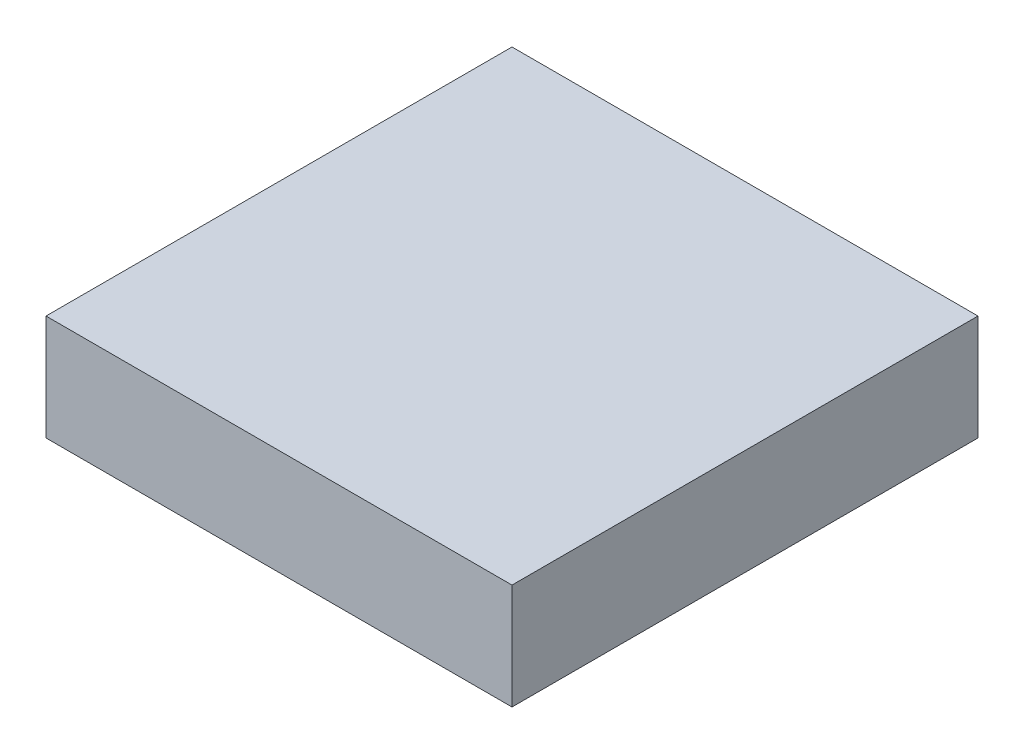
ISO-10303-21;
HEADER;
FILE_DESCRIPTION(('STEP AP214'),'2;1');
FILE_NAME('part.step','',(''),(''),'','','');
FILE_SCHEMA(('AUTOMOTIVE_DESIGN { 1 0 10303 214 1 1 1 1 }'));
ENDSEC;
DATA;
#1=APPLICATION_CONTEXT('core data for automotive mechanical design processes');
#2=APPLICATION_PROTOCOL_DEFINITION('international standard','automotive_design',2000,#1);
#3=PRODUCT_CONTEXT('',#1,'mechanical');
#4=PRODUCT('Part','Part','',(#3));
#5=PRODUCT_RELATED_PRODUCT_CATEGORY('part','',(#4));
#6=PRODUCT_DEFINITION_FORMATION('','',#4);
#7=PRODUCT_DEFINITION_CONTEXT('part definition',#1,'design');
#8=PRODUCT_DEFINITION('design','',#6,#7);
#9=PRODUCT_DEFINITION_SHAPE('','',#8);
#10=(LENGTH_UNIT() NAMED_UNIT(*) SI_UNIT(.MILLI.,.METRE.));
#11=(NAMED_UNIT(*) PLANE_ANGLE_UNIT() SI_UNIT($,.RADIAN.));
#12=(NAMED_UNIT(*) SI_UNIT($,.STERADIAN.) SOLID_ANGLE_UNIT());
#13=UNCERTAINTY_MEASURE_WITH_UNIT(LENGTH_MEASURE(1.E-05),#10,'distance_accuracy_value','');
#14=(GEOMETRIC_REPRESENTATION_CONTEXT(3) GLOBAL_UNCERTAINTY_ASSIGNED_CONTEXT((#13)) GLOBAL_UNIT_ASSIGNED_CONTEXT((#10,
#11,#12)) REPRESENTATION_CONTEXT('',''));
#15=CARTESIAN_POINT('',(0.,0.,0.));
#16=DIRECTION('',(0.,0.,1.));
#17=DIRECTION('',(1.,0.,0.));
#18=AXIS2_PLACEMENT_3D('',#15,#16,#17);
#19=CARTESIAN_POINT('',(150.,0.,0.));
#20=DIRECTION('',(0.,0.,-1.));
#21=DIRECTION('',(-1.,0.,0.));
#22=AXIS2_PLACEMENT_3D('',#19,#20,#21);
#23=PLANE('',#22);
#24=DIRECTION('',(0.,-1.,0.));
#25=VECTOR('',#24,1.);
#26=CARTESIAN_POINT('',(0.,0.,0.));
#27=LINE('',#26,#25);
#28=CARTESIAN_POINT('',(0.,0.,0.));
#29=VERTEX_POINT('',#28);
#30=CARTESIAN_POINT('',(0.,-34.,0.));
#31=VERTEX_POINT('',#30);
#32=EDGE_CURVE('E111',#29,#31,#27,.T.);
#33=ORIENTED_EDGE('',*,*,#32,.T.);
#34=DIRECTION('',(-1.,0.,0.));
#35=VECTOR('',#34,1.);
#36=CARTESIAN_POINT('',(150.,-34.,0.));
#37=LINE('',#36,#35);
#38=CARTESIAN_POINT('',(150.,-34.,0.));
#39=VERTEX_POINT('',#38);
#40=EDGE_CURVE('E11',#39,#31,#37,.T.);
#41=ORIENTED_EDGE('',*,*,#40,.F.);
#42=DIRECTION('',(0.,-1.,0.));
#43=VECTOR('',#42,1.);
#44=CARTESIAN_POINT('',(150.,0.,0.));
#45=LINE('',#44,#43);
#46=CARTESIAN_POINT('',(150.,0.,0.));
#47=VERTEX_POINT('',#46);
#48=EDGE_CURVE('E95',#47,#39,#45,.T.);
#49=ORIENTED_EDGE('',*,*,#48,.F.);
#50=DIRECTION('',(-1.,0.,0.));
#51=VECTOR('',#50,1.);
#52=CARTESIAN_POINT('',(150.,0.,0.));
#53=LINE('',#52,#51);
#54=EDGE_CURVE('E107',#47,#29,#53,.T.);
#55=ORIENTED_EDGE('',*,*,#54,.T.);
#56=EDGE_LOOP('',(#33,#41,#49,#55));
#57=FACE_BOUND('',#56,.T.);
#58=ADVANCED_FACE('F43',(#57),#23,.F.);
#59=CARTESIAN_POINT('',(150.,-34.,0.));
#60=DIRECTION('',(0.,1.,0.));
#61=DIRECTION('',(0.,0.,1.));
#62=AXIS2_PLACEMENT_3D('',#59,#60,#61);
#63=PLANE('',#62);
#64=DIRECTION('',(0.,0.,-1.));
#65=VECTOR('',#64,1.);
#66=CARTESIAN_POINT('',(0.,-34.,0.));
#67=LINE('',#66,#65);
#68=CARTESIAN_POINT('',(0.,-34.,-150.));
#69=VERTEX_POINT('',#68);
#70=EDGE_CURVE('E100',#31,#69,#67,.T.);
#71=ORIENTED_EDGE('',*,*,#70,.T.);
#72=DIRECTION('',(-1.,0.,0.));
#73=VECTOR('',#72,1.);
#74=CARTESIAN_POINT('',(150.,-34.,-150.));
#75=LINE('',#74,#73);
#76=CARTESIAN_POINT('',(150.,-34.,-150.));
#77=VERTEX_POINT('',#76);
#78=EDGE_CURVE('E52',#77,#69,#75,.T.);
#79=ORIENTED_EDGE('',*,*,#78,.F.);
#80=DIRECTION('',(0.,0.,-1.));
#81=VECTOR('',#80,1.);
#82=CARTESIAN_POINT('',(150.,-34.,0.));
#83=LINE('',#82,#81);
#84=EDGE_CURVE('E90',#39,#77,#83,.T.);
#85=ORIENTED_EDGE('',*,*,#84,.F.);
#86=ORIENTED_EDGE('',*,*,#40,.T.);
#87=EDGE_LOOP('',(#71,#79,#85,#86));
#88=FACE_BOUND('',#87,.T.);
#89=ADVANCED_FACE('F99',(#88),#63,.F.);
#90=CARTESIAN_POINT('',(150.,0.,-150.));
#91=DIRECTION('',(0.,0.,1.));
#92=DIRECTION('',(1.,0.,0.));
#93=AXIS2_PLACEMENT_3D('',#90,#91,#92);
#94=PLANE('',#93);
#95=DIRECTION('',(0.,1.,0.));
#96=VECTOR('',#95,1.);
#97=CARTESIAN_POINT('',(0.,0.,-150.));
#98=LINE('',#97,#96);
#99=CARTESIAN_POINT('',(0.,0.,-150.));
#100=VERTEX_POINT('',#99);
#101=EDGE_CURVE('E77',#69,#100,#98,.T.);
#102=ORIENTED_EDGE('',*,*,#101,.T.);
#103=DIRECTION('',(-1.,0.,0.));
#104=VECTOR('',#103,1.);
#105=CARTESIAN_POINT('',(150.,0.,-150.));
#106=LINE('',#105,#104);
#107=CARTESIAN_POINT('',(150.,0.,-150.));
#108=VERTEX_POINT('',#107);
#109=EDGE_CURVE('E102',#108,#100,#106,.T.);
#110=ORIENTED_EDGE('',*,*,#109,.F.);
#111=DIRECTION('',(0.,1.,0.));
#112=VECTOR('',#111,1.);
#113=CARTESIAN_POINT('',(150.,0.,-150.));
#114=LINE('',#113,#112);
#115=EDGE_CURVE('E93',#77,#108,#114,.T.);
#116=ORIENTED_EDGE('',*,*,#115,.F.);
#117=ORIENTED_EDGE('',*,*,#78,.T.);
#118=EDGE_LOOP('',(#102,#110,#116,#117));
#119=FACE_BOUND('',#118,.T.);
#120=ADVANCED_FACE('F103',(#119),#94,.F.);
#121=CARTESIAN_POINT('',(150.,0.,0.));
#122=DIRECTION('',(0.,-1.,0.));
#123=DIRECTION('',(0.,0.,-1.));
#124=AXIS2_PLACEMENT_3D('',#121,#122,#123);
#125=PLANE('',#124);
#126=DIRECTION('',(0.,0.,1.));
#127=VECTOR('',#126,1.);
#128=CARTESIAN_POINT('',(0.,0.,0.));
#129=LINE('',#128,#127);
#130=EDGE_CURVE('E83',#100,#29,#129,.T.);
#131=ORIENTED_EDGE('',*,*,#130,.T.);
#132=ORIENTED_EDGE('',*,*,#54,.F.);
#133=DIRECTION('',(0.,0.,1.));
#134=VECTOR('',#133,1.);
#135=CARTESIAN_POINT('',(150.,0.,0.));
#136=LINE('',#135,#134);
#137=EDGE_CURVE('E60',#108,#47,#136,.T.);
#138=ORIENTED_EDGE('',*,*,#137,.F.);
#139=ORIENTED_EDGE('',*,*,#109,.T.);
#140=EDGE_LOOP('',(#131,#132,#138,#139));
#141=FACE_BOUND('',#140,.T.);
#142=ADVANCED_FACE('F124',(#141),#125,.F.);
#143=CARTESIAN_POINT('',(150.,0.,0.));
#144=DIRECTION('',(1.,0.,0.));
#145=DIRECTION('',(0.,0.,-1.));
#146=AXIS2_PLACEMENT_3D('',#143,#144,#145);
#147=PLANE('',#146);
#148=ORIENTED_EDGE('',*,*,#48,.T.);
#149=ORIENTED_EDGE('',*,*,#84,.T.);
#150=ORIENTED_EDGE('',*,*,#115,.T.);
#151=ORIENTED_EDGE('',*,*,#137,.T.);
#152=EDGE_LOOP('',(#148,#149,#150,#151));
#153=FACE_BOUND('',#152,.T.);
#154=ADVANCED_FACE('F91',(#153),#147,.T.);
#155=CARTESIAN_POINT('',(0.,0.,0.));
#156=DIRECTION('',(1.,0.,0.));
#157=DIRECTION('',(0.,0.,-1.));
#158=AXIS2_PLACEMENT_3D('',#155,#156,#157);
#159=PLANE('',#158);
#160=ORIENTED_EDGE('',*,*,#32,.F.);
#161=ORIENTED_EDGE('',*,*,#130,.F.);
#162=ORIENTED_EDGE('',*,*,#101,.F.);
#163=ORIENTED_EDGE('',*,*,#70,.F.);
#164=EDGE_LOOP('',(#160,#161,#162,#163));
#165=FACE_BOUND('',#164,.T.);
#166=ADVANCED_FACE('F127',(#165),#159,.F.);
#167=CLOSED_SHELL('',(#58,#89,#120,#142,#154,#166));
#168=MANIFOLD_SOLID_BREP('B2',#167);
#169=ADVANCED_BREP_SHAPE_REPRESENTATION('',(#18,#168),#14);
#170=SHAPE_DEFINITION_REPRESENTATION(#9,#169);
ENDSEC;
END-ISO-10303-21;
